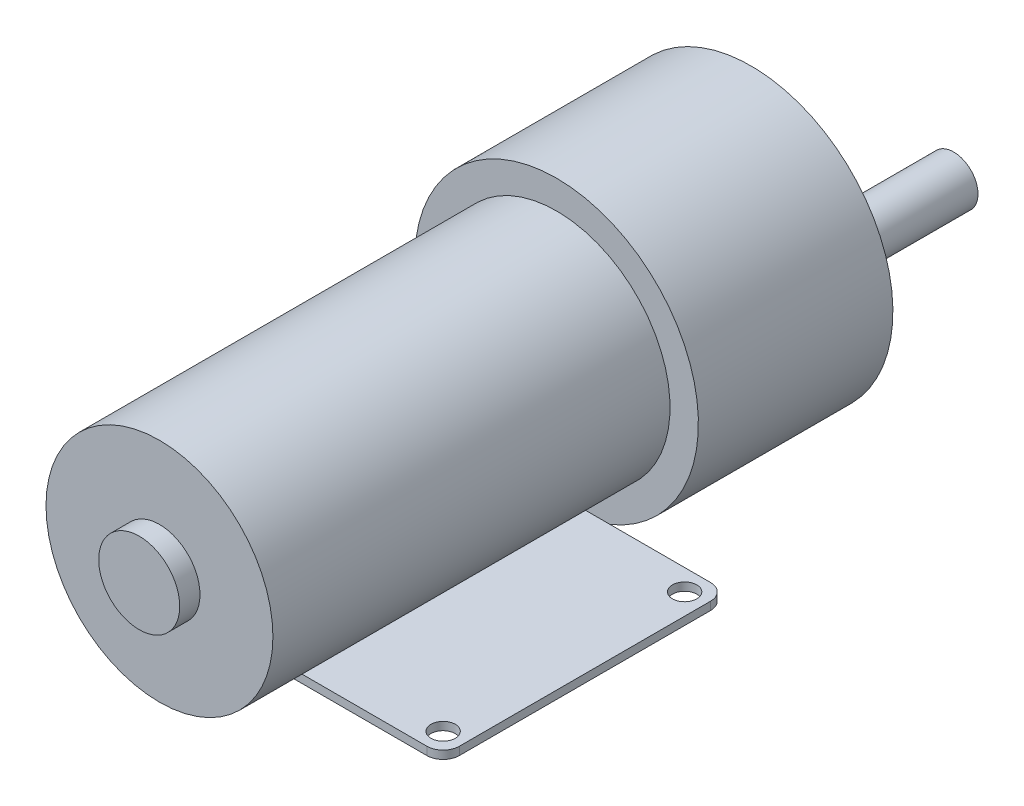
ISO-10303-21;
HEADER;
FILE_DESCRIPTION(('STEP AP214'),'2;1');
FILE_NAME('part.step','',(''),(''),'','','');
FILE_SCHEMA(('AUTOMOTIVE_DESIGN { 1 0 10303 214 1 1 1 1 }'));
ENDSEC;
DATA;
#1=APPLICATION_CONTEXT('core data for automotive mechanical design processes');
#2=APPLICATION_PROTOCOL_DEFINITION('international standard','automotive_design',2000,#1);
#3=PRODUCT_CONTEXT('',#1,'mechanical');
#4=PRODUCT('Part','Part','',(#3));
#5=PRODUCT_RELATED_PRODUCT_CATEGORY('part','',(#4));
#6=PRODUCT_DEFINITION_FORMATION('','',#4);
#7=PRODUCT_DEFINITION_CONTEXT('part definition',#1,'design');
#8=PRODUCT_DEFINITION('design','',#6,#7);
#9=PRODUCT_DEFINITION_SHAPE('','',#8);
#10=(LENGTH_UNIT() NAMED_UNIT(*) SI_UNIT(.MILLI.,.METRE.));
#11=(NAMED_UNIT(*) PLANE_ANGLE_UNIT() SI_UNIT($,.RADIAN.));
#12=(NAMED_UNIT(*) SI_UNIT($,.STERADIAN.) SOLID_ANGLE_UNIT());
#13=UNCERTAINTY_MEASURE_WITH_UNIT(LENGTH_MEASURE(1.E-05),#10,'distance_accuracy_value','');
#14=(GEOMETRIC_REPRESENTATION_CONTEXT(3) GLOBAL_UNCERTAINTY_ASSIGNED_CONTEXT((#13)) GLOBAL_UNIT_ASSIGNED_CONTEXT((#10,
#11,#12)) REPRESENTATION_CONTEXT('',''));
#15=CARTESIAN_POINT('',(0.,0.,0.));
#16=DIRECTION('',(0.,0.,1.));
#17=DIRECTION('',(1.,0.,0.));
#18=AXIS2_PLACEMENT_3D('',#15,#16,#17);
#19=CARTESIAN_POINT('',(9.64243739424703,0.,0.));
#20=DIRECTION('',(0.,0.,-1.));
#21=DIRECTION('',(-1.,0.,0.));
#22=AXIS2_PLACEMENT_3D('',#19,#20,#21);
#23=PLANE('',#22);
#24=DIRECTION('',(1.,0.,0.));
#25=VECTOR('',#24,1.);
#26=CARTESIAN_POINT('',(9.64243739424703,-17.2047762789047,0.));
#27=LINE('',#26,#25);
#28=CARTESIAN_POINT('',(6.44155108060861,-17.2047762789047,0.));
#29=VERTEX_POINT('',#28);
#30=CARTESIAN_POINT('',(12.8433237078854,-17.2047762789047,0.));
#31=VERTEX_POINT('',#30);
#32=EDGE_CURVE('E241',#29,#31,#27,.T.);
#33=ORIENTED_EDGE('',*,*,#32,.F.);
#34=CARTESIAN_POINT('',(9.64243739424703,0.,0.));
#35=DIRECTION('',(0.,0.,-1.));
#36=DIRECTION('',(-1.,0.,0.));
#37=AXIS2_PLACEMENT_3D('',#34,#35,#36);
#38=CIRCLE('',#37,17.5);
#39=EDGE_CURVE('E151',#31,#29,#38,.T.);
#40=ORIENTED_EDGE('',*,*,#39,.F.);
#41=EDGE_LOOP('',(#33,#40));
#42=FACE_BOUND('',#41,.T.);
#43=ADVANCED_FACE('F34',(#42),#23,.F.);
#44=CARTESIAN_POINT('',(9.64243739424703,0.,0.));
#45=DIRECTION('',(0.,0.,-1.));
#46=DIRECTION('',(-1.,0.,0.));
#47=AXIS2_PLACEMENT_3D('',#44,#45,#46);
#48=CIRCLE('',#47,14.);
#49=CARTESIAN_POINT('',(-4.35756260575297,0.,0.));
#50=VERTEX_POINT('',#49);
#51=EDGE_CURVE('E167',#50,#50,#48,.T.);
#52=ORIENTED_EDGE('',*,*,#51,.T.);
#53=EDGE_LOOP('',(#52));
#54=FACE_BOUND('',#53,.T.);
#55=DIRECTION('',(-1.,0.,0.));
#56=VECTOR('',#55,1.);
#57=CARTESIAN_POINT('',(9.64243739424703,-16.2047762789047,0.));
#58=LINE('',#57,#56);
#59=CARTESIAN_POINT('',(16.2496475279303,-16.2047762789047,0.));
#60=VERTEX_POINT('',#59);
#61=CARTESIAN_POINT('',(3.03522726056375,-16.2047762789047,0.));
#62=VERTEX_POINT('',#61);
#63=EDGE_CURVE('E132',#60,#62,#58,.T.);
#64=ORIENTED_EDGE('',*,*,#63,.F.);
#65=EDGE_CURVE('E153',#62,#60,#38,.T.);
#66=ORIENTED_EDGE('',*,*,#65,.F.);
#67=EDGE_LOOP('',(#64,#66));
#68=FACE_BOUND('',#67,.T.);
#69=ADVANCED_FACE('F155',(#54,#68),#23,.F.);
#70=CARTESIAN_POINT('',(9.64243739424703,-7.2,-49.));
#71=DIRECTION('',(0.,0.,1.));
#72=DIRECTION('',(1.,0.,0.));
#73=AXIS2_PLACEMENT_3D('',#70,#71,#72);
#74=CYLINDRICAL_SURFACE('',#73,3.);
#75=CARTESIAN_POINT('',(9.64243739424703,-7.2,-34.));
#76=DIRECTION('',(0.,0.,-1.));
#77=DIRECTION('',(-1.,0.,0.));
#78=AXIS2_PLACEMENT_3D('',#75,#76,#77);
#79=CIRCLE('',#78,3.);
#80=CARTESIAN_POINT('',(6.64243739424703,-7.2,-34.));
#81=VERTEX_POINT('',#80);
#82=EDGE_CURVE('E261',#81,#81,#79,.T.);
#83=ORIENTED_EDGE('',*,*,#82,.T.);
#84=EDGE_LOOP('',(#83));
#85=FACE_BOUND('',#84,.T.);
#86=CARTESIAN_POINT('',(9.64243739424703,-7.2,-37.));
#87=DIRECTION('',(0.,0.,-1.));
#88=DIRECTION('',(-1.,0.,0.));
#89=AXIS2_PLACEMENT_3D('',#86,#87,#88);
#90=CIRCLE('',#89,3.);
#91=CARTESIAN_POINT('',(11.3007497894247,-9.7,-37.));
#92=VERTEX_POINT('',#91);
#93=CARTESIAN_POINT('',(7.98412499906933,-9.7,-37.));
#94=VERTEX_POINT('',#93);
#95=EDGE_CURVE('E179',#92,#94,#90,.T.);
#96=ORIENTED_EDGE('',*,*,#95,.F.);
#97=DIRECTION('',(0.,0.,-1.));
#98=VECTOR('',#97,1.);
#99=CARTESIAN_POINT('',(11.3007497894247,-9.7,-37.));
#100=LINE('',#99,#98);
#101=CARTESIAN_POINT('',(11.3007497894247,-9.7,-49.));
#102=VERTEX_POINT('',#101);
#103=EDGE_CURVE('E256',#92,#102,#100,.T.);
#104=ORIENTED_EDGE('',*,*,#103,.T.);
#105=CARTESIAN_POINT('',(9.64243739424703,-7.2,-49.));
#106=DIRECTION('',(0.,0.,-1.));
#107=DIRECTION('',(-1.,0.,0.));
#108=AXIS2_PLACEMENT_3D('',#105,#106,#107);
#109=CIRCLE('',#108,3.);
#110=CARTESIAN_POINT('',(7.98412499906933,-9.7,-49.));
#111=VERTEX_POINT('',#110);
#112=EDGE_CURVE('E264',#111,#102,#109,.T.);
#113=ORIENTED_EDGE('',*,*,#112,.F.);
#114=DIRECTION('',(0.,0.,-1.));
#115=VECTOR('',#114,1.);
#116=CARTESIAN_POINT('',(7.98412499906933,-9.7,-37.));
#117=LINE('',#116,#115);
#118=EDGE_CURVE('E259',#94,#111,#117,.T.);
#119=ORIENTED_EDGE('',*,*,#118,.F.);
#120=EDGE_LOOP('',(#96,#104,#113,#119));
#121=FACE_BOUND('',#120,.T.);
#122=ADVANCED_FACE('F297',(#85,#121),#74,.T.);
#123=CARTESIAN_POINT('',(9.64243739424703,-7.2,-49.));
#124=DIRECTION('',(0.,0.,-1.));
#125=DIRECTION('',(-1.,0.,0.));
#126=AXIS2_PLACEMENT_3D('',#123,#124,#125);
#127=PLANE('',#126);
#128=ORIENTED_EDGE('',*,*,#112,.T.);
#129=DIRECTION('',(-1.,0.,0.));
#130=VECTOR('',#129,1.);
#131=CARTESIAN_POINT('',(11.3007497894247,-9.7,-49.));
#132=LINE('',#131,#130);
#133=EDGE_CURVE('E252',#102,#111,#132,.T.);
#134=ORIENTED_EDGE('',*,*,#133,.T.);
#135=EDGE_LOOP('',(#128,#134));
#136=FACE_BOUND('',#135,.T.);
#137=ADVANCED_FACE('F286',(#136),#127,.T.);
#138=CARTESIAN_POINT('',(9.64243739424703,-7.2,-34.));
#139=DIRECTION('',(0.,0.,-1.));
#140=DIRECTION('',(-1.,0.,0.));
#141=AXIS2_PLACEMENT_3D('',#138,#139,#140);
#142=PLANE('',#141);
#143=CARTESIAN_POINT('',(9.64243739424703,-7.2,-34.));
#144=DIRECTION('',(0.,0.,-1.));
#145=DIRECTION('',(-1.,0.,0.));
#146=AXIS2_PLACEMENT_3D('',#143,#144,#145);
#147=CIRCLE('',#146,6.);
#148=CARTESIAN_POINT('',(3.64243739424703,-7.2,-34.));
#149=VERTEX_POINT('',#148);
#150=EDGE_CURVE('E160',#149,#149,#147,.T.);
#151=ORIENTED_EDGE('',*,*,#150,.T.);
#152=EDGE_LOOP('',(#151));
#153=FACE_BOUND('',#152,.T.);
#154=ORIENTED_EDGE('',*,*,#82,.F.);
#155=EDGE_LOOP('',(#154));
#156=FACE_BOUND('',#155,.T.);
#157=ADVANCED_FACE('F276',(#153,#156),#142,.T.);
#158=CARTESIAN_POINT('',(9.64243739424703,0.,-24.));
#159=DIRECTION('',(0.,0.,-1.));
#160=DIRECTION('',(-1.,0.,0.));
#161=AXIS2_PLACEMENT_3D('',#158,#159,#160);
#162=PLANE('',#161);
#163=CARTESIAN_POINT('',(9.64243739424703,0.,-24.));
#164=DIRECTION('',(0.,0.,-1.));
#165=DIRECTION('',(-1.,0.,0.));
#166=AXIS2_PLACEMENT_3D('',#163,#164,#165);
#167=CIRCLE('',#166,17.5);
#168=CARTESIAN_POINT('',(-7.85756260575298,0.,-24.));
#169=VERTEX_POINT('',#168);
#170=EDGE_CURVE('E150',#169,#169,#167,.T.);
#171=ORIENTED_EDGE('',*,*,#170,.T.);
#172=EDGE_LOOP('',(#171));
#173=FACE_BOUND('',#172,.T.);
#174=CARTESIAN_POINT('',(9.64243739424703,-7.2,-24.));
#175=DIRECTION('',(0.,0.,-1.));
#176=DIRECTION('',(-1.,0.,0.));
#177=AXIS2_PLACEMENT_3D('',#174,#175,#176);
#178=CIRCLE('',#177,6.);
#179=CARTESIAN_POINT('',(3.64243739424703,-7.2,-24.));
#180=VERTEX_POINT('',#179);
#181=EDGE_CURVE('E162',#180,#180,#178,.T.);
#182=ORIENTED_EDGE('',*,*,#181,.F.);
#183=EDGE_LOOP('',(#182));
#184=FACE_BOUND('',#183,.T.);
#185=ADVANCED_FACE('F273',(#173,#184),#162,.T.);
#186=CARTESIAN_POINT('',(9.64243739424703,0.,49.));
#187=DIRECTION('',(0.,0.,1.));
#188=DIRECTION('',(1.,0.,0.));
#189=AXIS2_PLACEMENT_3D('',#186,#187,#188);
#190=PLANE('',#189);
#191=CARTESIAN_POINT('',(9.64243739424703,0.,49.));
#192=DIRECTION('',(0.,0.,1.));
#193=DIRECTION('',(1.,0.,0.));
#194=AXIS2_PLACEMENT_3D('',#191,#192,#193);
#195=CIRCLE('',#194,14.);
#196=CARTESIAN_POINT('',(23.642437394247,0.,49.));
#197=VERTEX_POINT('',#196);
#198=EDGE_CURVE('E174',#197,#197,#195,.T.);
#199=ORIENTED_EDGE('',*,*,#198,.T.);
#200=EDGE_LOOP('',(#199));
#201=FACE_BOUND('',#200,.T.);
#202=CARTESIAN_POINT('',(9.64243739424703,0.,49.));
#203=DIRECTION('',(0.,0.,1.));
#204=DIRECTION('',(1.,0.,0.));
#205=AXIS2_PLACEMENT_3D('',#202,#203,#204);
#206=CIRCLE('',#205,5.);
#207=CARTESIAN_POINT('',(14.642437394247,0.,49.));
#208=VERTEX_POINT('',#207);
#209=EDGE_CURVE('E170',#208,#208,#206,.T.);
#210=ORIENTED_EDGE('',*,*,#209,.F.);
#211=EDGE_LOOP('',(#210));
#212=FACE_BOUND('',#211,.T.);
#213=ADVANCED_FACE('F275',(#201,#212),#190,.T.);
#214=CARTESIAN_POINT('',(9.64243739424703,0.,49.));
#215=DIRECTION('',(0.,0.,-1.));
#216=DIRECTION('',(-1.,0.,0.));
#217=AXIS2_PLACEMENT_3D('',#214,#215,#216);
#218=CYLINDRICAL_SURFACE('',#217,14.);
#219=ORIENTED_EDGE('',*,*,#198,.F.);
#220=EDGE_LOOP('',(#219));
#221=FACE_BOUND('',#220,.T.);
#222=ORIENTED_EDGE('',*,*,#51,.F.);
#223=EDGE_LOOP('',(#222));
#224=FACE_BOUND('',#223,.T.);
#225=ADVANCED_FACE('F283',(#221,#224),#218,.T.);
#226=CARTESIAN_POINT('',(9.64243739424703,0.,51.5));
#227=DIRECTION('',(0.,0.,-1.));
#228=DIRECTION('',(-1.,0.,0.));
#229=AXIS2_PLACEMENT_3D('',#226,#227,#228);
#230=CYLINDRICAL_SURFACE('',#229,5.);
#231=CARTESIAN_POINT('',(9.64243739424703,0.,51.5));
#232=DIRECTION('',(0.,0.,1.));
#233=DIRECTION('',(1.,0.,0.));
#234=AXIS2_PLACEMENT_3D('',#231,#232,#233);
#235=CIRCLE('',#234,5.);
#236=CARTESIAN_POINT('',(14.642437394247,0.,51.5));
#237=VERTEX_POINT('',#236);
#238=EDGE_CURVE('E171',#237,#237,#235,.T.);
#239=ORIENTED_EDGE('',*,*,#238,.F.);
#240=EDGE_LOOP('',(#239));
#241=FACE_BOUND('',#240,.T.);
#242=ORIENTED_EDGE('',*,*,#209,.T.);
#243=EDGE_LOOP('',(#242));
#244=FACE_BOUND('',#243,.T.);
#245=ADVANCED_FACE('F307',(#241,#244),#230,.T.);
#246=CARTESIAN_POINT('',(9.64243739424703,0.,51.5));
#247=DIRECTION('',(0.,0.,1.));
#248=DIRECTION('',(1.,0.,0.));
#249=AXIS2_PLACEMENT_3D('',#246,#247,#248);
#250=PLANE('',#249);
#251=ORIENTED_EDGE('',*,*,#238,.T.);
#252=EDGE_LOOP('',(#251));
#253=FACE_BOUND('',#252,.T.);
#254=ADVANCED_FACE('F303',(#253),#250,.T.);
#255=CARTESIAN_POINT('',(9.64243739424703,0.,-24.));
#256=DIRECTION('',(0.,0.,1.));
#257=DIRECTION('',(1.,0.,0.));
#258=AXIS2_PLACEMENT_3D('',#255,#256,#257);
#259=CYLINDRICAL_SURFACE('',#258,17.5);
#260=ORIENTED_EDGE('',*,*,#170,.F.);
#261=EDGE_LOOP('',(#260));
#262=FACE_BOUND('',#261,.T.);
#263=EDGE_CURVE('E142',#60,#31,#38,.T.);
#264=ORIENTED_EDGE('',*,*,#263,.T.);
#265=ORIENTED_EDGE('',*,*,#39,.T.);
#266=EDGE_CURVE('E159',#29,#62,#38,.T.);
#267=ORIENTED_EDGE('',*,*,#266,.T.);
#268=ORIENTED_EDGE('',*,*,#65,.T.);
#269=EDGE_LOOP('',(#264,#265,#267,#268));
#270=FACE_BOUND('',#269,.T.);
#271=ADVANCED_FACE('F157',(#262,#270),#259,.T.);
#272=CARTESIAN_POINT('',(9.64243739424703,-7.2,-34.));
#273=DIRECTION('',(0.,0.,1.));
#274=DIRECTION('',(1.,0.,0.));
#275=AXIS2_PLACEMENT_3D('',#272,#273,#274);
#276=CYLINDRICAL_SURFACE('',#275,6.);
#277=ORIENTED_EDGE('',*,*,#150,.F.);
#278=EDGE_LOOP('',(#277));
#279=FACE_BOUND('',#278,.T.);
#280=ORIENTED_EDGE('',*,*,#181,.T.);
#281=EDGE_LOOP('',(#280));
#282=FACE_BOUND('',#281,.T.);
#283=ADVANCED_FACE('F271',(#279,#282),#276,.T.);
#284=CARTESIAN_POINT('',(9.64243739424703,0.,-37.));
#285=DIRECTION('',(0.,0.,-1.));
#286=DIRECTION('',(-1.,0.,0.));
#287=AXIS2_PLACEMENT_3D('',#284,#285,#286);
#288=PLANE('',#287);
#289=ORIENTED_EDGE('',*,*,#95,.T.);
#290=DIRECTION('',(-1.,0.,0.));
#291=VECTOR('',#290,1.);
#292=CARTESIAN_POINT('',(11.3007497894247,-9.7,-37.));
#293=LINE('',#292,#291);
#294=EDGE_CURVE('E253',#92,#94,#293,.T.);
#295=ORIENTED_EDGE('',*,*,#294,.F.);
#296=EDGE_LOOP('',(#289,#295));
#297=FACE_BOUND('',#296,.T.);
#298=ADVANCED_FACE('F359',(#297),#288,.T.);
#299=CARTESIAN_POINT('',(11.3007497894247,-9.7,-37.));
#300=DIRECTION('',(0.,-1.,0.));
#301=DIRECTION('',(0.,0.,-1.));
#302=AXIS2_PLACEMENT_3D('',#299,#300,#301);
#303=PLANE('',#302);
#304=ORIENTED_EDGE('',*,*,#133,.F.);
#305=ORIENTED_EDGE('',*,*,#103,.F.);
#306=ORIENTED_EDGE('',*,*,#294,.T.);
#307=ORIENTED_EDGE('',*,*,#118,.T.);
#308=EDGE_LOOP('',(#304,#305,#306,#307));
#309=FACE_BOUND('',#308,.T.);
#310=ADVANCED_FACE('F353',(#309),#303,.T.);
#311=CARTESIAN_POINT('',(0.,0.,0.));
#312=DIRECTION('',(0.,0.,1.));
#313=DIRECTION('',(1.,0.,0.));
#314=AXIS2_PLACEMENT_3D('',#311,#312,#313);
#315=PLANE('',#314);
#316=CARTESIAN_POINT('',(-9.35756260575297,-17.2047762789047,0.));
#317=VERTEX_POINT('',#316);
#318=EDGE_CURVE('E240',#317,#29,#27,.T.);
#319=ORIENTED_EDGE('',*,*,#318,.F.);
#320=DIRECTION('',(0.,-1.,0.));
#321=VECTOR('',#320,1.);
#322=CARTESIAN_POINT('',(-9.35756260575297,0.,0.));
#323=LINE('',#322,#321);
#324=CARTESIAN_POINT('',(-9.35756260575297,-16.2047762789047,0.));
#325=VERTEX_POINT('',#324);
#326=EDGE_CURVE('E12',#317,#325,#323,.F.);
#327=ORIENTED_EDGE('',*,*,#326,.T.);
#328=EDGE_CURVE('E139',#62,#325,#58,.T.);
#329=ORIENTED_EDGE('',*,*,#328,.F.);
#330=ORIENTED_EDGE('',*,*,#266,.F.);
#331=EDGE_LOOP('',(#319,#327,#329,#330));
#332=FACE_BOUND('',#331,.T.);
#333=ADVANCED_FACE('F351',(#332),#315,.F.);
#334=CARTESIAN_POINT('',(28.642437394247,-16.2047762789047,0.));
#335=VERTEX_POINT('',#334);
#336=EDGE_CURVE('E126',#335,#60,#58,.T.);
#337=ORIENTED_EDGE('',*,*,#336,.F.);
#338=DIRECTION('',(0.,1.,0.));
#339=VECTOR('',#338,1.);
#340=CARTESIAN_POINT('',(28.642437394247,0.,0.));
#341=LINE('',#340,#339);
#342=CARTESIAN_POINT('',(28.642437394247,-17.2047762789047,0.));
#343=VERTEX_POINT('',#342);
#344=EDGE_CURVE('E193',#335,#343,#341,.F.);
#345=ORIENTED_EDGE('',*,*,#344,.T.);
#346=EDGE_CURVE('E145',#31,#343,#27,.T.);
#347=ORIENTED_EDGE('',*,*,#346,.F.);
#348=ORIENTED_EDGE('',*,*,#263,.F.);
#349=EDGE_LOOP('',(#337,#345,#347,#348));
#350=FACE_BOUND('',#349,.T.);
#351=ADVANCED_FACE('F143',(#350),#315,.F.);
#352=CARTESIAN_POINT('',(-11.357562605753,-16.2047762789047,35.));
#353=DIRECTION('',(1.,0.,0.));
#354=DIRECTION('',(0.,0.,-1.));
#355=AXIS2_PLACEMENT_3D('',#352,#353,#354);
#356=PLANE('',#355);
#357=DIRECTION('',(0.,0.,-1.));
#358=VECTOR('',#357,1.);
#359=CARTESIAN_POINT('',(-11.357562605753,-16.2047762789047,35.));
#360=LINE('',#359,#358);
#361=CARTESIAN_POINT('',(-11.357562605753,-16.2047762789047,33.));
#362=VERTEX_POINT('',#361);
#363=CARTESIAN_POINT('',(-11.357562605753,-16.2047762789047,2.));
#364=VERTEX_POINT('',#363);
#365=EDGE_CURVE('E249',#362,#364,#360,.T.);
#366=ORIENTED_EDGE('',*,*,#365,.T.);
#367=DIRECTION('',(0.,-1.,0.));
#368=VECTOR('',#367,1.);
#369=CARTESIAN_POINT('',(-11.357562605753,-16.2047762789047,2.));
#370=LINE('',#369,#368);
#371=CARTESIAN_POINT('',(-11.357562605753,-17.2047762789047,2.));
#372=VERTEX_POINT('',#371);
#373=EDGE_CURVE('E43',#364,#372,#370,.T.);
#374=ORIENTED_EDGE('',*,*,#373,.T.);
#375=DIRECTION('',(0.,0.,-1.));
#376=VECTOR('',#375,1.);
#377=CARTESIAN_POINT('',(-11.357562605753,-17.2047762789047,35.));
#378=LINE('',#377,#376);
#379=CARTESIAN_POINT('',(-11.357562605753,-17.2047762789047,33.));
#380=VERTEX_POINT('',#379);
#381=EDGE_CURVE('E247',#380,#372,#378,.T.);
#382=ORIENTED_EDGE('',*,*,#381,.F.);
#383=DIRECTION('',(0.,-1.,0.));
#384=VECTOR('',#383,1.);
#385=CARTESIAN_POINT('',(-11.357562605753,-16.2047762789047,33.));
#386=LINE('',#385,#384);
#387=EDGE_CURVE('E207',#380,#362,#386,.F.);
#388=ORIENTED_EDGE('',*,*,#387,.T.);
#389=EDGE_LOOP('',(#366,#374,#382,#388));
#390=FACE_BOUND('',#389,.T.);
#391=ADVANCED_FACE('F334',(#390),#356,.F.);
#392=CARTESIAN_POINT('',(9.64243739424703,-17.2047762789047,35.));
#393=DIRECTION('',(0.,1.,0.));
#394=DIRECTION('',(0.,0.,1.));
#395=AXIS2_PLACEMENT_3D('',#392,#393,#394);
#396=PLANE('',#395);
#397=CARTESIAN_POINT('',(28.042437394247,-17.2047762789047,2.6));
#398=DIRECTION('',(0.,-1.,0.));
#399=DIRECTION('',(0.,0.,-1.));
#400=AXIS2_PLACEMENT_3D('',#397,#398,#399);
#401=CIRCLE('',#400,1.5);
#402=CARTESIAN_POINT('',(28.042437394247,-17.2047762789047,1.1));
#403=VERTEX_POINT('',#402);
#404=EDGE_CURVE('E229',#403,#403,#401,.T.);
#405=ORIENTED_EDGE('',*,*,#404,.F.);
#406=EDGE_LOOP('',(#405));
#407=FACE_BOUND('',#406,.T.);
#408=CARTESIAN_POINT('',(-8.75756260575297,-17.2047762789047,2.6));
#409=DIRECTION('',(0.,-1.,0.));
#410=DIRECTION('',(0.,0.,-1.));
#411=AXIS2_PLACEMENT_3D('',#408,#409,#410);
#412=CIRCLE('',#411,1.5);
#413=CARTESIAN_POINT('',(-8.75756260575297,-17.2047762789047,1.1));
#414=VERTEX_POINT('',#413);
#415=EDGE_CURVE('E219',#414,#414,#412,.T.);
#416=ORIENTED_EDGE('',*,*,#415,.F.);
#417=EDGE_LOOP('',(#416));
#418=FACE_BOUND('',#417,.T.);
#419=CARTESIAN_POINT('',(-8.75756260575297,-17.2047762789047,32.4));
#420=DIRECTION('',(0.,-1.,0.));
#421=DIRECTION('',(0.,0.,-1.));
#422=AXIS2_PLACEMENT_3D('',#419,#420,#421);
#423=CIRCLE('',#422,1.5);
#424=CARTESIAN_POINT('',(-8.75756260575297,-17.2047762789047,30.9));
#425=VERTEX_POINT('',#424);
#426=EDGE_CURVE('E216',#425,#425,#423,.T.);
#427=ORIENTED_EDGE('',*,*,#426,.F.);
#428=EDGE_LOOP('',(#427));
#429=FACE_BOUND('',#428,.T.);
#430=CARTESIAN_POINT('',(28.042437394247,-17.2047762789047,32.4));
#431=DIRECTION('',(0.,-1.,0.));
#432=DIRECTION('',(0.,0.,-1.));
#433=AXIS2_PLACEMENT_3D('',#430,#431,#432);
#434=CIRCLE('',#433,1.5);
#435=CARTESIAN_POINT('',(28.042437394247,-17.2047762789047,30.9));
#436=VERTEX_POINT('',#435);
#437=EDGE_CURVE('E213',#436,#436,#434,.T.);
#438=ORIENTED_EDGE('',*,*,#437,.F.);
#439=EDGE_LOOP('',(#438));
#440=FACE_BOUND('',#439,.T.);
#441=ORIENTED_EDGE('',*,*,#346,.T.);
#442=CARTESIAN_POINT('',(28.642437394247,-17.2047762789047,2.));
#443=DIRECTION('',(0.,1.,0.));
#444=DIRECTION('',(0.,0.,1.));
#445=AXIS2_PLACEMENT_3D('',#442,#443,#444);
#446=CIRCLE('',#445,2.);
#447=CARTESIAN_POINT('',(30.642437394247,-17.2047762789047,2.));
#448=VERTEX_POINT('',#447);
#449=EDGE_CURVE('E199',#343,#448,#446,.F.);
#450=ORIENTED_EDGE('',*,*,#449,.T.);
#451=DIRECTION('',(0.,0.,-1.));
#452=VECTOR('',#451,1.);
#453=CARTESIAN_POINT('',(30.642437394247,-17.2047762789047,35.));
#454=LINE('',#453,#452);
#455=CARTESIAN_POINT('',(30.642437394247,-17.2047762789047,33.));
#456=VERTEX_POINT('',#455);
#457=EDGE_CURVE('E244',#456,#448,#454,.T.);
#458=ORIENTED_EDGE('',*,*,#457,.F.);
#459=CARTESIAN_POINT('',(28.642437394247,-17.2047762789047,33.));
#460=DIRECTION('',(0.,1.,0.));
#461=DIRECTION('',(0.,0.,1.));
#462=AXIS2_PLACEMENT_3D('',#459,#460,#461);
#463=CIRCLE('',#462,2.);
#464=CARTESIAN_POINT('',(28.642437394247,-17.2047762789047,35.));
#465=VERTEX_POINT('',#464);
#466=EDGE_CURVE('E197',#456,#465,#463,.F.);
#467=ORIENTED_EDGE('',*,*,#466,.T.);
#468=DIRECTION('',(1.,0.,0.));
#469=VECTOR('',#468,1.);
#470=CARTESIAN_POINT('',(9.64243739424703,-17.2047762789047,35.));
#471=LINE('',#470,#469);
#472=CARTESIAN_POINT('',(-9.35756260575297,-17.2047762789047,35.));
#473=VERTEX_POINT('',#472);
#474=EDGE_CURVE('E236',#473,#465,#471,.T.);
#475=ORIENTED_EDGE('',*,*,#474,.F.);
#476=CARTESIAN_POINT('',(-9.35756260575297,-17.2047762789047,33.));
#477=DIRECTION('',(0.,1.,0.));
#478=DIRECTION('',(0.,0.,1.));
#479=AXIS2_PLACEMENT_3D('',#476,#477,#478);
#480=CIRCLE('',#479,2.);
#481=EDGE_CURVE('E59',#473,#380,#480,.F.);
#482=ORIENTED_EDGE('',*,*,#481,.T.);
#483=ORIENTED_EDGE('',*,*,#381,.T.);
#484=CARTESIAN_POINT('',(-9.35756260575297,-17.2047762789047,2.));
#485=DIRECTION('',(0.,1.,0.));
#486=DIRECTION('',(0.,0.,1.));
#487=AXIS2_PLACEMENT_3D('',#484,#485,#486);
#488=CIRCLE('',#487,2.);
#489=EDGE_CURVE('E51',#372,#317,#488,.F.);
#490=ORIENTED_EDGE('',*,*,#489,.T.);
#491=ORIENTED_EDGE('',*,*,#318,.T.);
#492=ORIENTED_EDGE('',*,*,#32,.T.);
#493=EDGE_LOOP('',(#441,#450,#458,#467,#475,#482,#483,#490,#491,#492));
#494=FACE_BOUND('',#493,.T.);
#495=ADVANCED_FACE('F348',(#407,#418,#429,#440,#494),#396,.F.);
#496=CARTESIAN_POINT('',(30.642437394247,-16.2047762789047,35.));
#497=DIRECTION('',(-1.,0.,0.));
#498=DIRECTION('',(0.,0.,1.));
#499=AXIS2_PLACEMENT_3D('',#496,#497,#498);
#500=PLANE('',#499);
#501=ORIENTED_EDGE('',*,*,#457,.T.);
#502=DIRECTION('',(0.,1.,0.));
#503=VECTOR('',#502,1.);
#504=CARTESIAN_POINT('',(30.642437394247,-16.2047762789047,2.));
#505=LINE('',#504,#503);
#506=CARTESIAN_POINT('',(30.642437394247,-16.2047762789047,2.));
#507=VERTEX_POINT('',#506);
#508=EDGE_CURVE('E183',#448,#507,#505,.T.);
#509=ORIENTED_EDGE('',*,*,#508,.T.);
#510=DIRECTION('',(0.,0.,-1.));
#511=VECTOR('',#510,1.);
#512=CARTESIAN_POINT('',(30.642437394247,-16.2047762789047,35.));
#513=LINE('',#512,#511);
#514=CARTESIAN_POINT('',(30.642437394247,-16.2047762789047,33.));
#515=VERTEX_POINT('',#514);
#516=EDGE_CURVE('E239',#515,#507,#513,.T.);
#517=ORIENTED_EDGE('',*,*,#516,.F.);
#518=DIRECTION('',(0.,1.,0.));
#519=VECTOR('',#518,1.);
#520=CARTESIAN_POINT('',(30.642437394247,-17.2047762789047,33.));
#521=LINE('',#520,#519);
#522=EDGE_CURVE('E181',#515,#456,#521,.F.);
#523=ORIENTED_EDGE('',*,*,#522,.T.);
#524=EDGE_LOOP('',(#501,#509,#517,#523));
#525=FACE_BOUND('',#524,.T.);
#526=ADVANCED_FACE('F344',(#525),#500,.F.);
#527=CARTESIAN_POINT('',(9.64243739424703,-16.2047762789047,35.));
#528=DIRECTION('',(0.,-1.,0.));
#529=DIRECTION('',(1.,0.,0.));
#530=AXIS2_PLACEMENT_3D('',#527,#528,#529);
#531=PLANE('',#530);
#532=CARTESIAN_POINT('',(28.042437394247,-16.2047762789047,2.6));
#533=DIRECTION('',(0.,-1.,0.));
#534=DIRECTION('',(1.,0.,0.));
#535=AXIS2_PLACEMENT_3D('',#532,#533,#534);
#536=CIRCLE('',#535,1.5);
#537=CARTESIAN_POINT('',(29.542437394247,-16.2047762789047,2.6));
#538=VERTEX_POINT('',#537);
#539=EDGE_CURVE('E38',#538,#538,#536,.T.);
#540=ORIENTED_EDGE('',*,*,#539,.T.);
#541=EDGE_LOOP('',(#540));
#542=FACE_BOUND('',#541,.T.);
#543=CARTESIAN_POINT('',(-8.75756260575297,-16.2047762789047,2.6));
#544=DIRECTION('',(0.,-1.,0.));
#545=DIRECTION('',(1.,0.,0.));
#546=AXIS2_PLACEMENT_3D('',#543,#544,#545);
#547=CIRCLE('',#546,1.5);
#548=CARTESIAN_POINT('',(-7.25756260575297,-16.2047762789047,2.6));
#549=VERTEX_POINT('',#548);
#550=EDGE_CURVE('E217',#549,#549,#547,.T.);
#551=ORIENTED_EDGE('',*,*,#550,.T.);
#552=EDGE_LOOP('',(#551));
#553=FACE_BOUND('',#552,.T.);
#554=CARTESIAN_POINT('',(-8.75756260575297,-16.2047762789047,32.4));
#555=DIRECTION('',(0.,-1.,0.));
#556=DIRECTION('',(1.,0.,0.));
#557=AXIS2_PLACEMENT_3D('',#554,#555,#556);
#558=CIRCLE('',#557,1.5);
#559=CARTESIAN_POINT('',(-7.25756260575297,-16.2047762789047,32.4));
#560=VERTEX_POINT('',#559);
#561=EDGE_CURVE('E214',#560,#560,#558,.T.);
#562=ORIENTED_EDGE('',*,*,#561,.T.);
#563=EDGE_LOOP('',(#562));
#564=FACE_BOUND('',#563,.T.);
#565=CARTESIAN_POINT('',(28.042437394247,-16.2047762789047,32.4));
#566=DIRECTION('',(0.,-1.,0.));
#567=DIRECTION('',(1.,0.,0.));
#568=AXIS2_PLACEMENT_3D('',#565,#566,#567);
#569=CIRCLE('',#568,1.5);
#570=CARTESIAN_POINT('',(29.542437394247,-16.2047762789047,32.4));
#571=VERTEX_POINT('',#570);
#572=EDGE_CURVE('E210',#571,#571,#569,.T.);
#573=ORIENTED_EDGE('',*,*,#572,.T.);
#574=EDGE_LOOP('',(#573));
#575=FACE_BOUND('',#574,.T.);
#576=ORIENTED_EDGE('',*,*,#516,.T.);
#577=CARTESIAN_POINT('',(28.642437394247,-16.2047762789047,2.));
#578=DIRECTION('',(0.,-1.,0.));
#579=DIRECTION('',(1.,0.,0.));
#580=AXIS2_PLACEMENT_3D('',#577,#578,#579);
#581=CIRCLE('',#580,2.);
#582=EDGE_CURVE('E134',#507,#335,#581,.F.);
#583=ORIENTED_EDGE('',*,*,#582,.T.);
#584=ORIENTED_EDGE('',*,*,#336,.T.);
#585=ORIENTED_EDGE('',*,*,#63,.T.);
#586=ORIENTED_EDGE('',*,*,#328,.T.);
#587=CARTESIAN_POINT('',(-9.35756260575297,-16.2047762789047,2.));
#588=DIRECTION('',(0.,-1.,0.));
#589=DIRECTION('',(1.,0.,0.));
#590=AXIS2_PLACEMENT_3D('',#587,#588,#589);
#591=CIRCLE('',#590,2.);
#592=EDGE_CURVE('E188',#325,#364,#591,.F.);
#593=ORIENTED_EDGE('',*,*,#592,.T.);
#594=ORIENTED_EDGE('',*,*,#365,.F.);
#595=CARTESIAN_POINT('',(-9.35756260575297,-16.2047762789047,33.));
#596=DIRECTION('',(0.,-1.,0.));
#597=DIRECTION('',(1.,0.,0.));
#598=AXIS2_PLACEMENT_3D('',#595,#596,#597);
#599=CIRCLE('',#598,2.);
#600=CARTESIAN_POINT('',(-9.35756260575297,-16.2047762789047,35.));
#601=VERTEX_POINT('',#600);
#602=EDGE_CURVE('E186',#362,#601,#599,.F.);
#603=ORIENTED_EDGE('',*,*,#602,.T.);
#604=DIRECTION('',(-1.,0.,0.));
#605=VECTOR('',#604,1.);
#606=CARTESIAN_POINT('',(9.64243739424703,-16.2047762789047,35.));
#607=LINE('',#606,#605);
#608=CARTESIAN_POINT('',(28.642437394247,-16.2047762789047,35.));
#609=VERTEX_POINT('',#608);
#610=EDGE_CURVE('E137',#609,#601,#607,.T.);
#611=ORIENTED_EDGE('',*,*,#610,.F.);
#612=CARTESIAN_POINT('',(28.642437394247,-16.2047762789047,33.));
#613=DIRECTION('',(0.,-1.,0.));
#614=DIRECTION('',(1.,0.,0.));
#615=AXIS2_PLACEMENT_3D('',#612,#613,#614);
#616=CIRCLE('',#615,2.);
#617=EDGE_CURVE('E190',#609,#515,#616,.F.);
#618=ORIENTED_EDGE('',*,*,#617,.T.);
#619=EDGE_LOOP('',(#576,#583,#584,#585,#586,#593,#594,#603,#611,#618));
#620=FACE_BOUND('',#619,.T.);
#621=ADVANCED_FACE('F129',(#542,#553,#564,#575,#620),#531,.F.);
#622=CARTESIAN_POINT('',(0.,0.,35.));
#623=DIRECTION('',(0.,0.,1.));
#624=DIRECTION('',(1.,0.,0.));
#625=AXIS2_PLACEMENT_3D('',#622,#623,#624);
#626=PLANE('',#625);
#627=ORIENTED_EDGE('',*,*,#474,.T.);
#628=DIRECTION('',(0.,1.,0.));
#629=VECTOR('',#628,1.);
#630=CARTESIAN_POINT('',(28.642437394247,-16.2047762789047,35.));
#631=LINE('',#630,#629);
#632=EDGE_CURVE('E204',#465,#609,#631,.T.);
#633=ORIENTED_EDGE('',*,*,#632,.T.);
#634=ORIENTED_EDGE('',*,*,#610,.T.);
#635=DIRECTION('',(0.,-1.,0.));
#636=VECTOR('',#635,1.);
#637=CARTESIAN_POINT('',(-9.35756260575297,-17.2047762789047,35.));
#638=LINE('',#637,#636);
#639=EDGE_CURVE('E201',#601,#473,#638,.T.);
#640=ORIENTED_EDGE('',*,*,#639,.T.);
#641=EDGE_LOOP('',(#627,#633,#634,#640));
#642=FACE_BOUND('',#641,.T.);
#643=ADVANCED_FACE('F319',(#642),#626,.T.);
#644=CARTESIAN_POINT('',(28.642437394247,-16.2047762789047,2.));
#645=DIRECTION('',(0.,1.,0.));
#646=DIRECTION('',(0.,0.,1.));
#647=AXIS2_PLACEMENT_3D('',#644,#645,#646);
#648=CYLINDRICAL_SURFACE('',#647,2.);
#649=ORIENTED_EDGE('',*,*,#449,.F.);
#650=ORIENTED_EDGE('',*,*,#344,.F.);
#651=ORIENTED_EDGE('',*,*,#582,.F.);
#652=ORIENTED_EDGE('',*,*,#508,.F.);
#653=EDGE_LOOP('',(#649,#650,#651,#652));
#654=FACE_BOUND('',#653,.T.);
#655=ADVANCED_FACE('F315',(#654),#648,.T.);
#656=CARTESIAN_POINT('',(28.642437394247,0.,33.));
#657=DIRECTION('',(0.,-1.,0.));
#658=DIRECTION('',(0.,0.,-1.));
#659=AXIS2_PLACEMENT_3D('',#656,#657,#658);
#660=CYLINDRICAL_SURFACE('',#659,2.);
#661=ORIENTED_EDGE('',*,*,#466,.F.);
#662=ORIENTED_EDGE('',*,*,#522,.F.);
#663=ORIENTED_EDGE('',*,*,#617,.F.);
#664=ORIENTED_EDGE('',*,*,#632,.F.);
#665=EDGE_LOOP('',(#661,#662,#663,#664));
#666=FACE_BOUND('',#665,.T.);
#667=ADVANCED_FACE('F318',(#666),#660,.T.);
#668=CARTESIAN_POINT('',(-9.35756260575297,-16.2047762789047,2.));
#669=DIRECTION('',(0.,-1.,0.));
#670=DIRECTION('',(0.,0.,-1.));
#671=AXIS2_PLACEMENT_3D('',#668,#669,#670);
#672=CYLINDRICAL_SURFACE('',#671,2.);
#673=ORIENTED_EDGE('',*,*,#592,.F.);
#674=ORIENTED_EDGE('',*,*,#326,.F.);
#675=ORIENTED_EDGE('',*,*,#489,.F.);
#676=ORIENTED_EDGE('',*,*,#373,.F.);
#677=EDGE_LOOP('',(#673,#674,#675,#676));
#678=FACE_BOUND('',#677,.T.);
#679=ADVANCED_FACE('F322',(#678),#672,.T.);
#680=CARTESIAN_POINT('',(-9.35756260575297,0.,33.));
#681=DIRECTION('',(0.,1.,0.));
#682=DIRECTION('',(0.,0.,1.));
#683=AXIS2_PLACEMENT_3D('',#680,#681,#682);
#684=CYLINDRICAL_SURFACE('',#683,2.);
#685=ORIENTED_EDGE('',*,*,#602,.F.);
#686=ORIENTED_EDGE('',*,*,#387,.F.);
#687=ORIENTED_EDGE('',*,*,#481,.F.);
#688=ORIENTED_EDGE('',*,*,#639,.F.);
#689=EDGE_LOOP('',(#685,#686,#687,#688));
#690=FACE_BOUND('',#689,.T.);
#691=ADVANCED_FACE('F36',(#690),#684,.T.);
#692=CARTESIAN_POINT('',(28.042437394247,17.7952237210953,32.4));
#693=DIRECTION('',(0.,-1.,0.));
#694=DIRECTION('',(0.,0.,-1.));
#695=AXIS2_PLACEMENT_3D('',#692,#693,#694);
#696=CYLINDRICAL_SURFACE('',#695,1.5);
#697=ORIENTED_EDGE('',*,*,#437,.T.);
#698=EDGE_LOOP('',(#697));
#699=FACE_BOUND('',#698,.T.);
#700=ORIENTED_EDGE('',*,*,#572,.F.);
#701=EDGE_LOOP('',(#700));
#702=FACE_BOUND('',#701,.T.);
#703=ADVANCED_FACE('F328',(#699,#702),#696,.F.);
#704=CARTESIAN_POINT('',(-8.75756260575297,17.7952237210953,32.4));
#705=DIRECTION('',(0.,-1.,0.));
#706=DIRECTION('',(0.,0.,-1.));
#707=AXIS2_PLACEMENT_3D('',#704,#705,#706);
#708=CYLINDRICAL_SURFACE('',#707,1.5);
#709=ORIENTED_EDGE('',*,*,#426,.T.);
#710=EDGE_LOOP('',(#709));
#711=FACE_BOUND('',#710,.T.);
#712=ORIENTED_EDGE('',*,*,#561,.F.);
#713=EDGE_LOOP('',(#712));
#714=FACE_BOUND('',#713,.T.);
#715=ADVANCED_FACE('F497',(#711,#714),#708,.F.);
#716=CARTESIAN_POINT('',(-8.75756260575297,17.7952237210953,2.6));
#717=DIRECTION('',(0.,-1.,0.));
#718=DIRECTION('',(0.,0.,-1.));
#719=AXIS2_PLACEMENT_3D('',#716,#717,#718);
#720=CYLINDRICAL_SURFACE('',#719,1.5);
#721=ORIENTED_EDGE('',*,*,#415,.T.);
#722=EDGE_LOOP('',(#721));
#723=FACE_BOUND('',#722,.T.);
#724=ORIENTED_EDGE('',*,*,#550,.F.);
#725=EDGE_LOOP('',(#724));
#726=FACE_BOUND('',#725,.T.);
#727=ADVANCED_FACE('F506',(#723,#726),#720,.F.);
#728=CARTESIAN_POINT('',(28.042437394247,17.7952237210953,2.6));
#729=DIRECTION('',(0.,-1.,0.));
#730=DIRECTION('',(0.,0.,-1.));
#731=AXIS2_PLACEMENT_3D('',#728,#729,#730);
#732=CYLINDRICAL_SURFACE('',#731,1.5);
#733=ORIENTED_EDGE('',*,*,#404,.T.);
#734=EDGE_LOOP('',(#733));
#735=FACE_BOUND('',#734,.T.);
#736=ORIENTED_EDGE('',*,*,#539,.F.);
#737=EDGE_LOOP('',(#736));
#738=FACE_BOUND('',#737,.T.);
#739=ADVANCED_FACE('F516',(#735,#738),#732,.F.);
#740=CLOSED_SHELL('',(#43,#69,#122,#137,#157,#185,#213,#225,#245,#254,#271,#283,#298,#310,#333,
#351,#391,#495,#526,#621,#643,#655,#667,#679,#691,#703,#715,#727,#739));
#741=MANIFOLD_SOLID_BREP('B2',#740);
#742=ADVANCED_BREP_SHAPE_REPRESENTATION('',(#18,#741),#14);
#743=SHAPE_DEFINITION_REPRESENTATION(#9,#742);
ENDSEC;
END-ISO-10303-21;
